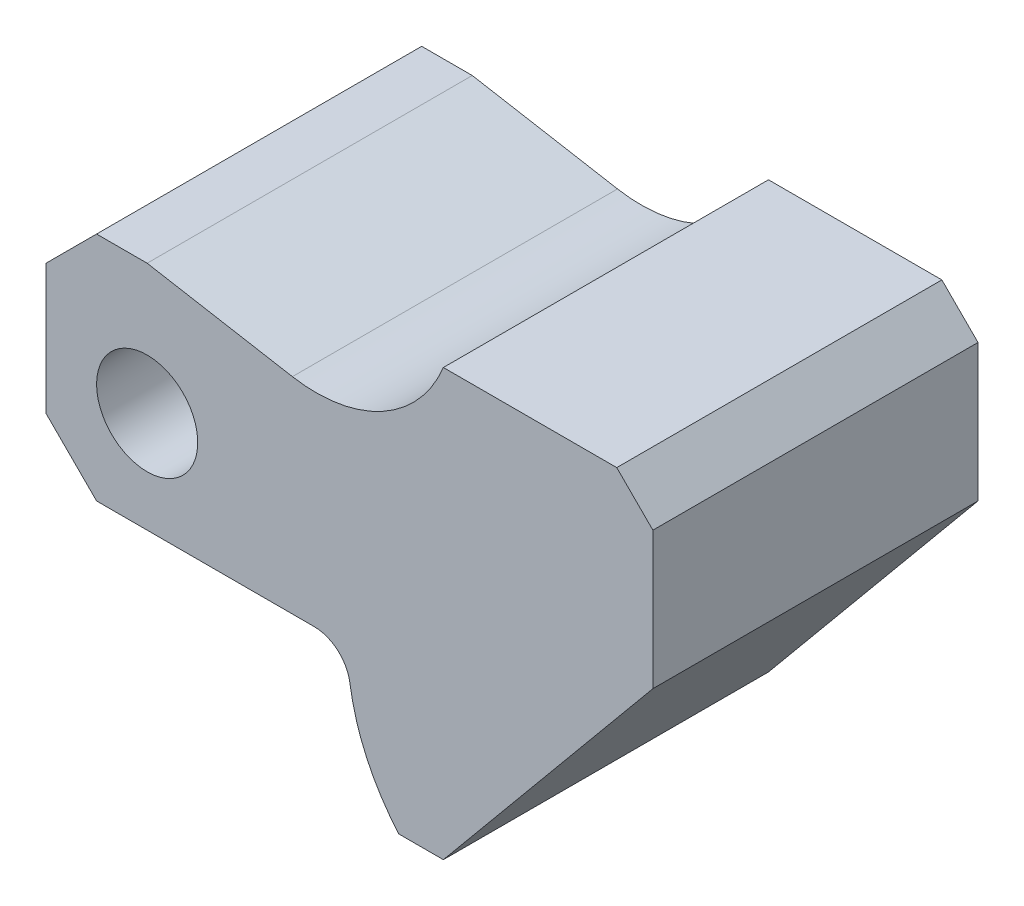
ISO-10303-21;
HEADER;
FILE_DESCRIPTION(('STEP AP214'),'2;1');
FILE_NAME('part.step','',(''),(''),'','','');
FILE_SCHEMA(('AUTOMOTIVE_DESIGN { 1 0 10303 214 1 1 1 1 }'));
ENDSEC;
DATA;
#1=APPLICATION_CONTEXT('core data for automotive mechanical design processes');
#2=APPLICATION_PROTOCOL_DEFINITION('international standard','automotive_design',2000,#1);
#3=PRODUCT_CONTEXT('',#1,'mechanical');
#4=PRODUCT('Part','Part','',(#3));
#5=PRODUCT_RELATED_PRODUCT_CATEGORY('part','',(#4));
#6=PRODUCT_DEFINITION_FORMATION('','',#4);
#7=PRODUCT_DEFINITION_CONTEXT('part definition',#1,'design');
#8=PRODUCT_DEFINITION('design','',#6,#7);
#9=PRODUCT_DEFINITION_SHAPE('','',#8);
#10=(LENGTH_UNIT() NAMED_UNIT(*) SI_UNIT(.MILLI.,.METRE.));
#11=(NAMED_UNIT(*) PLANE_ANGLE_UNIT() SI_UNIT($,.RADIAN.));
#12=(NAMED_UNIT(*) SI_UNIT($,.STERADIAN.) SOLID_ANGLE_UNIT());
#13=UNCERTAINTY_MEASURE_WITH_UNIT(LENGTH_MEASURE(1.E-05),#10,'distance_accuracy_value','');
#14=(GEOMETRIC_REPRESENTATION_CONTEXT(3) GLOBAL_UNCERTAINTY_ASSIGNED_CONTEXT((#13)) GLOBAL_UNIT_ASSIGNED_CONTEXT((#10,
#11,#12)) REPRESENTATION_CONTEXT('',''));
#15=CARTESIAN_POINT('',(0.,0.,0.));
#16=DIRECTION('',(0.,0.,1.));
#17=DIRECTION('',(1.,0.,0.));
#18=AXIS2_PLACEMENT_3D('',#15,#16,#17);
#19=CARTESIAN_POINT('',(30.4033577276848,47.1664622192664,22.5));
#20=DIRECTION('',(0.,0.,-1.));
#21=DIRECTION('',(-1.,0.,0.));
#22=AXIS2_PLACEMENT_3D('',#19,#20,#21);
#23=PLANE('',#22);
#24=DIRECTION('',(1.,0.,0.));
#25=VECTOR('',#24,1.);
#26=CARTESIAN_POINT('',(30.1125137012567,0.,22.5));
#27=LINE('',#26,#25);
#28=CARTESIAN_POINT('',(0.,0.,22.5));
#29=VERTEX_POINT('',#28);
#30=CARTESIAN_POINT('',(30.1125137012567,0.,22.5));
#31=VERTEX_POINT('',#30);
#32=EDGE_CURVE('E197',#29,#31,#27,.T.);
#33=ORIENTED_EDGE('',*,*,#32,.T.);
#34=CARTESIAN_POINT('',(30.1125137012567,-5.,22.5));
#35=DIRECTION('',(0.,0.,-1.));
#36=DIRECTION('',(1.,0.,0.));
#37=AXIS2_PLACEMENT_3D('',#34,#35,#36);
#38=CIRCLE('',#37,5.);
#39=CARTESIAN_POINT('',(35.0581524426685,-4.26470588235294,22.5));
#40=VERTEX_POINT('',#39);
#41=EDGE_CURVE('E115',#31,#40,#38,.T.);
#42=ORIENTED_EDGE('',*,*,#41,.T.);
#43=CARTESIAN_POINT('',(63.7428571428571,0.,22.5));
#44=DIRECTION('',(0.,0.,1.));
#45=DIRECTION('',(-1.,0.,0.));
#46=AXIS2_PLACEMENT_3D('',#43,#44,#45);
#47=CIRCLE('',#46,29.);
#48=CARTESIAN_POINT('',(41.8339548426505,-19.,22.5));
#49=VERTEX_POINT('',#48);
#50=EDGE_CURVE('E230',#40,#49,#47,.T.);
#51=ORIENTED_EDGE('',*,*,#50,.T.);
#52=DIRECTION('',(1.,0.,0.));
#53=VECTOR('',#52,1.);
#54=CARTESIAN_POINT('',(48.,-19.,22.5));
#55=LINE('',#54,#53);
#56=CARTESIAN_POINT('',(48.,-19.,22.5));
#57=VERTEX_POINT('',#56);
#58=EDGE_CURVE('E249',#49,#57,#55,.T.);
#59=ORIENTED_EDGE('',*,*,#58,.T.);
#60=DIRECTION('',(0.638017864750323,0.770021560905562,0.));
#61=VECTOR('',#60,1.);
#62=CARTESIAN_POINT('',(77.,16.,22.5));
#63=LINE('',#62,#61);
#64=CARTESIAN_POINT('',(77.,16.,22.5));
#65=VERTEX_POINT('',#64);
#66=EDGE_CURVE('E246',#57,#65,#63,.T.);
#67=ORIENTED_EDGE('',*,*,#66,.T.);
#68=DIRECTION('',(0.,1.,0.));
#69=VECTOR('',#68,1.);
#70=CARTESIAN_POINT('',(77.,35.,22.5));
#71=LINE('',#70,#69);
#72=CARTESIAN_POINT('',(77.,35.,22.5));
#73=VERTEX_POINT('',#72);
#74=EDGE_CURVE('E248',#65,#73,#71,.T.);
#75=ORIENTED_EDGE('',*,*,#74,.T.);
#76=DIRECTION('',(-0.70710678118654,0.707106781186555,0.));
#77=VECTOR('',#76,1.);
#78=CARTESIAN_POINT('',(77.,35.,22.5));
#79=LINE('',#78,#77);
#80=CARTESIAN_POINT('',(72.0000000000001,40.,22.5));
#81=VERTEX_POINT('',#80);
#82=EDGE_CURVE('E251',#73,#81,#79,.T.);
#83=ORIENTED_EDGE('',*,*,#82,.T.);
#84=DIRECTION('',(-1.,0.,0.));
#85=VECTOR('',#84,1.);
#86=CARTESIAN_POINT('',(72.0000000000001,40.,22.5));
#87=LINE('',#86,#85);
#88=CARTESIAN_POINT('',(48.,40.,22.5));
#89=VERTEX_POINT('',#88);
#90=EDGE_CURVE('E257',#81,#89,#87,.T.);
#91=ORIENTED_EDGE('',*,*,#90,.T.);
#92=CARTESIAN_POINT('',(30.4033577276848,47.1664622192664,22.5));
#93=DIRECTION('',(0.,0.,-1.));
#94=DIRECTION('',(-1.,0.,0.));
#95=AXIS2_PLACEMENT_3D('',#92,#93,#94);
#96=CIRCLE('',#95,19.);
#97=CARTESIAN_POINT('',(27.1040423520132,28.4551149120344,22.5));
#98=VERTEX_POINT('',#97);
#99=EDGE_CURVE('E259',#89,#98,#96,.T.);
#100=ORIENTED_EDGE('',*,*,#99,.T.);
#101=DIRECTION('',(-0.984807753012208,0.173648177666931,0.));
#102=VECTOR('',#101,1.);
#103=CARTESIAN_POINT('',(6.99999999999998,32.,22.5));
#104=LINE('',#103,#102);
#105=CARTESIAN_POINT('',(6.99999999999998,32.,22.5));
#106=VERTEX_POINT('',#105);
#107=EDGE_CURVE('E261',#98,#106,#104,.T.);
#108=ORIENTED_EDGE('',*,*,#107,.T.);
#109=DIRECTION('',(-1.,0.,0.));
#110=VECTOR('',#109,1.);
#111=CARTESIAN_POINT('',(0.,32.,22.5));
#112=LINE('',#111,#110);
#113=CARTESIAN_POINT('',(0.,32.,22.5));
#114=VERTEX_POINT('',#113);
#115=EDGE_CURVE('E152',#106,#114,#112,.T.);
#116=ORIENTED_EDGE('',*,*,#115,.T.);
#117=DIRECTION('',(-0.707106781186549,-0.707106781186546,0.));
#118=VECTOR('',#117,1.);
#119=CARTESIAN_POINT('',(-7.00000000000003,25.,22.5));
#120=LINE('',#119,#118);
#121=CARTESIAN_POINT('',(-7.00000000000003,25.,22.5));
#122=VERTEX_POINT('',#121);
#123=EDGE_CURVE('E146',#114,#122,#120,.T.);
#124=ORIENTED_EDGE('',*,*,#123,.T.);
#125=DIRECTION('',(0.,-1.,0.));
#126=VECTOR('',#125,1.);
#127=CARTESIAN_POINT('',(-7.00000000000002,7.,22.5));
#128=LINE('',#127,#126);
#129=CARTESIAN_POINT('',(-7.00000000000002,7.,22.5));
#130=VERTEX_POINT('',#129);
#131=EDGE_CURVE('E150',#122,#130,#128,.T.);
#132=ORIENTED_EDGE('',*,*,#131,.T.);
#133=DIRECTION('',(0.707106781186549,-0.707106781186546,0.));
#134=VECTOR('',#133,1.);
#135=CARTESIAN_POINT('',(0.,0.,22.5));
#136=LINE('',#135,#134);
#137=EDGE_CURVE('E54',#130,#29,#136,.T.);
#138=ORIENTED_EDGE('',*,*,#137,.T.);
#139=EDGE_LOOP('',(#33,#42,#51,#59,#67,#75,#83,#91,#100,#108,#116,#124,#132,#138));
#140=FACE_BOUND('',#139,.T.);
#141=CARTESIAN_POINT('',(6.99999999999998,14.,22.5));
#142=DIRECTION('',(0.,0.,1.));
#143=DIRECTION('',(1.,0.,0.));
#144=AXIS2_PLACEMENT_3D('',#141,#142,#143);
#145=CIRCLE('',#144,7.);
#146=CARTESIAN_POINT('',(0.,14.,22.5));
#147=VERTEX_POINT('',#146);
#148=EDGE_CURVE('E174',#147,#147,#145,.T.);
#149=ORIENTED_EDGE('',*,*,#148,.F.);
#150=EDGE_LOOP('',(#149));
#151=FACE_BOUND('',#150,.T.);
#152=ADVANCED_FACE('F37',(#140,#151),#23,.F.);
#153=CARTESIAN_POINT('',(30.4033577276848,47.1664622192664,-22.5));
#154=DIRECTION('',(0.,0.,-1.));
#155=DIRECTION('',(-1.,0.,0.));
#156=AXIS2_PLACEMENT_3D('',#153,#154,#155);
#157=PLANE('',#156);
#158=DIRECTION('',(1.,0.,0.));
#159=VECTOR('',#158,1.);
#160=CARTESIAN_POINT('',(30.1125137012567,0.,-22.5));
#161=LINE('',#160,#159);
#162=CARTESIAN_POINT('',(0.,0.,-22.5));
#163=VERTEX_POINT('',#162);
#164=CARTESIAN_POINT('',(30.1125137012567,0.,-22.5));
#165=VERTEX_POINT('',#164);
#166=EDGE_CURVE('E170',#163,#165,#161,.T.);
#167=ORIENTED_EDGE('',*,*,#166,.F.);
#168=DIRECTION('',(0.707106781186549,-0.707106781186546,0.));
#169=VECTOR('',#168,1.);
#170=CARTESIAN_POINT('',(0.,0.,-22.5));
#171=LINE('',#170,#169);
#172=CARTESIAN_POINT('',(-7.00000000000002,7.,-22.5));
#173=VERTEX_POINT('',#172);
#174=EDGE_CURVE('E107',#173,#163,#171,.T.);
#175=ORIENTED_EDGE('',*,*,#174,.F.);
#176=DIRECTION('',(0.,-1.,0.));
#177=VECTOR('',#176,1.);
#178=CARTESIAN_POINT('',(-7.00000000000002,7.,-22.5));
#179=LINE('',#178,#177);
#180=CARTESIAN_POINT('',(-7.00000000000003,25.,-22.5));
#181=VERTEX_POINT('',#180);
#182=EDGE_CURVE('E101',#181,#173,#179,.T.);
#183=ORIENTED_EDGE('',*,*,#182,.F.);
#184=DIRECTION('',(-0.707106781186549,-0.707106781186546,0.));
#185=VECTOR('',#184,1.);
#186=CARTESIAN_POINT('',(-7.00000000000003,25.,-22.5));
#187=LINE('',#186,#185);
#188=CARTESIAN_POINT('',(0.,32.,-22.5));
#189=VERTEX_POINT('',#188);
#190=EDGE_CURVE('E160',#189,#181,#187,.T.);
#191=ORIENTED_EDGE('',*,*,#190,.F.);
#192=DIRECTION('',(-1.,0.,0.));
#193=VECTOR('',#192,1.);
#194=CARTESIAN_POINT('',(0.,32.,-22.5));
#195=LINE('',#194,#193);
#196=CARTESIAN_POINT('',(6.99999999999998,32.,-22.5));
#197=VERTEX_POINT('',#196);
#198=EDGE_CURVE('E192',#197,#189,#195,.T.);
#199=ORIENTED_EDGE('',*,*,#198,.F.);
#200=DIRECTION('',(-0.984807753012208,0.173648177666931,0.));
#201=VECTOR('',#200,1.);
#202=CARTESIAN_POINT('',(6.99999999999998,32.,-22.5));
#203=LINE('',#202,#201);
#204=CARTESIAN_POINT('',(27.1040423520132,28.4551149120344,-22.5));
#205=VERTEX_POINT('',#204);
#206=EDGE_CURVE('E190',#205,#197,#203,.T.);
#207=ORIENTED_EDGE('',*,*,#206,.F.);
#208=CARTESIAN_POINT('',(30.4033577276848,47.1664622192664,-22.5));
#209=DIRECTION('',(0.,0.,-1.));
#210=DIRECTION('',(-1.,0.,0.));
#211=AXIS2_PLACEMENT_3D('',#208,#209,#210);
#212=CIRCLE('',#211,19.);
#213=CARTESIAN_POINT('',(48.,40.,-22.5));
#214=VERTEX_POINT('',#213);
#215=EDGE_CURVE('E188',#214,#205,#212,.T.);
#216=ORIENTED_EDGE('',*,*,#215,.F.);
#217=DIRECTION('',(-1.,0.,0.));
#218=VECTOR('',#217,1.);
#219=CARTESIAN_POINT('',(72.0000000000001,40.,-22.5));
#220=LINE('',#219,#218);
#221=CARTESIAN_POINT('',(72.0000000000001,40.,-22.5));
#222=VERTEX_POINT('',#221);
#223=EDGE_CURVE('E186',#222,#214,#220,.T.);
#224=ORIENTED_EDGE('',*,*,#223,.F.);
#225=DIRECTION('',(-0.70710678118654,0.707106781186555,0.));
#226=VECTOR('',#225,1.);
#227=CARTESIAN_POINT('',(77.,35.,-22.5));
#228=LINE('',#227,#226);
#229=CARTESIAN_POINT('',(77.,35.,-22.5));
#230=VERTEX_POINT('',#229);
#231=EDGE_CURVE('E184',#230,#222,#228,.T.);
#232=ORIENTED_EDGE('',*,*,#231,.F.);
#233=DIRECTION('',(0.,1.,0.));
#234=VECTOR('',#233,1.);
#235=CARTESIAN_POINT('',(77.,35.,-22.5));
#236=LINE('',#235,#234);
#237=CARTESIAN_POINT('',(77.,16.,-22.5));
#238=VERTEX_POINT('',#237);
#239=EDGE_CURVE('E182',#238,#230,#236,.T.);
#240=ORIENTED_EDGE('',*,*,#239,.F.);
#241=DIRECTION('',(0.638017864750323,0.770021560905562,0.));
#242=VECTOR('',#241,1.);
#243=CARTESIAN_POINT('',(77.,16.,-22.5));
#244=LINE('',#243,#242);
#245=CARTESIAN_POINT('',(48.,-19.,-22.5));
#246=VERTEX_POINT('',#245);
#247=EDGE_CURVE('E180',#246,#238,#244,.T.);
#248=ORIENTED_EDGE('',*,*,#247,.F.);
#249=DIRECTION('',(1.,0.,0.));
#250=VECTOR('',#249,1.);
#251=CARTESIAN_POINT('',(48.,-19.,-22.5));
#252=LINE('',#251,#250);
#253=CARTESIAN_POINT('',(41.8339548426505,-19.,-22.5));
#254=VERTEX_POINT('',#253);
#255=EDGE_CURVE('E178',#254,#246,#252,.T.);
#256=ORIENTED_EDGE('',*,*,#255,.F.);
#257=CARTESIAN_POINT('',(63.7428571428571,0.,-22.5));
#258=DIRECTION('',(0.,0.,1.));
#259=DIRECTION('',(-1.,0.,0.));
#260=AXIS2_PLACEMENT_3D('',#257,#258,#259);
#261=CIRCLE('',#260,29.);
#262=CARTESIAN_POINT('',(35.0581524426685,-4.26470588235294,-22.5));
#263=VERTEX_POINT('',#262);
#264=EDGE_CURVE('E176',#263,#254,#261,.T.);
#265=ORIENTED_EDGE('',*,*,#264,.F.);
#266=CARTESIAN_POINT('',(30.1125137012567,-5.,-22.5));
#267=DIRECTION('',(0.,0.,-1.));
#268=DIRECTION('',(1.,0.,0.));
#269=AXIS2_PLACEMENT_3D('',#266,#267,#268);
#270=CIRCLE('',#269,5.);
#271=EDGE_CURVE('E173',#165,#263,#270,.T.);
#272=ORIENTED_EDGE('',*,*,#271,.F.);
#273=EDGE_LOOP('',(#167,#175,#183,#191,#199,#207,#216,#224,#232,#240,#248,#256,#265,#272));
#274=FACE_BOUND('',#273,.T.);
#275=CARTESIAN_POINT('',(6.99999999999998,14.,-22.5));
#276=DIRECTION('',(0.,0.,1.));
#277=DIRECTION('',(1.,0.,0.));
#278=AXIS2_PLACEMENT_3D('',#275,#276,#277);
#279=CIRCLE('',#278,7.);
#280=CARTESIAN_POINT('',(0.,14.,-22.5));
#281=VERTEX_POINT('',#280);
#282=EDGE_CURVE('E434',#281,#281,#279,.T.);
#283=ORIENTED_EDGE('',*,*,#282,.T.);
#284=EDGE_LOOP('',(#283));
#285=FACE_BOUND('',#284,.T.);
#286=ADVANCED_FACE('F234',(#274,#285),#157,.T.);
#287=CARTESIAN_POINT('',(30.1125137012567,0.,22.5));
#288=DIRECTION('',(0.,1.,0.));
#289=DIRECTION('',(0.,0.,1.));
#290=AXIS2_PLACEMENT_3D('',#287,#288,#289);
#291=PLANE('',#290);
#292=ORIENTED_EDGE('',*,*,#166,.T.);
#293=DIRECTION('',(0.,0.,-1.));
#294=VECTOR('',#293,1.);
#295=CARTESIAN_POINT('',(30.1125137012567,0.,22.5));
#296=LINE('',#295,#294);
#297=EDGE_CURVE('E11',#31,#165,#296,.T.);
#298=ORIENTED_EDGE('',*,*,#297,.F.);
#299=ORIENTED_EDGE('',*,*,#32,.F.);
#300=DIRECTION('',(0.,0.,-1.));
#301=VECTOR('',#300,1.);
#302=CARTESIAN_POINT('',(0.,0.,22.5));
#303=LINE('',#302,#301);
#304=EDGE_CURVE('E166',#29,#163,#303,.T.);
#305=ORIENTED_EDGE('',*,*,#304,.T.);
#306=EDGE_LOOP('',(#292,#298,#299,#305));
#307=FACE_BOUND('',#306,.T.);
#308=ADVANCED_FACE('F39',(#307),#291,.F.);
#309=CARTESIAN_POINT('',(30.1125137012567,-5.,22.5));
#310=DIRECTION('',(0.,0.,-1.));
#311=DIRECTION('',(-1.,0.,0.));
#312=AXIS2_PLACEMENT_3D('',#309,#310,#311);
#313=CYLINDRICAL_SURFACE('',#312,5.);
#314=ORIENTED_EDGE('',*,*,#271,.T.);
#315=DIRECTION('',(0.,0.,-1.));
#316=VECTOR('',#315,1.);
#317=CARTESIAN_POINT('',(35.0581524426685,-4.26470588235294,22.5));
#318=LINE('',#317,#316);
#319=EDGE_CURVE('E46',#40,#263,#318,.T.);
#320=ORIENTED_EDGE('',*,*,#319,.F.);
#321=ORIENTED_EDGE('',*,*,#41,.F.);
#322=ORIENTED_EDGE('',*,*,#297,.T.);
#323=EDGE_LOOP('',(#314,#320,#321,#322));
#324=FACE_BOUND('',#323,.T.);
#325=ADVANCED_FACE('F295',(#324),#313,.F.);
#326=CARTESIAN_POINT('',(63.7428571428571,0.,22.5));
#327=DIRECTION('',(0.,0.,-1.));
#328=DIRECTION('',(-1.,0.,0.));
#329=AXIS2_PLACEMENT_3D('',#326,#327,#328);
#330=CYLINDRICAL_SURFACE('',#329,29.);
#331=ORIENTED_EDGE('',*,*,#264,.T.);
#332=DIRECTION('',(0.,0.,-1.));
#333=VECTOR('',#332,1.);
#334=CARTESIAN_POINT('',(41.8339548426505,-19.,22.5));
#335=LINE('',#334,#333);
#336=EDGE_CURVE('E222',#49,#254,#335,.T.);
#337=ORIENTED_EDGE('',*,*,#336,.F.);
#338=ORIENTED_EDGE('',*,*,#50,.F.);
#339=ORIENTED_EDGE('',*,*,#319,.T.);
#340=EDGE_LOOP('',(#331,#337,#338,#339));
#341=FACE_BOUND('',#340,.T.);
#342=ADVANCED_FACE('F228',(#341),#330,.T.);
#343=CARTESIAN_POINT('',(48.,-19.,22.5));
#344=DIRECTION('',(0.,1.,0.));
#345=DIRECTION('',(-1.,0.,0.));
#346=AXIS2_PLACEMENT_3D('',#343,#344,#345);
#347=PLANE('',#346);
#348=ORIENTED_EDGE('',*,*,#255,.T.);
#349=DIRECTION('',(0.,0.,-1.));
#350=VECTOR('',#349,1.);
#351=CARTESIAN_POINT('',(48.,-19.,22.5));
#352=LINE('',#351,#350);
#353=EDGE_CURVE('E219',#57,#246,#352,.T.);
#354=ORIENTED_EDGE('',*,*,#353,.F.);
#355=ORIENTED_EDGE('',*,*,#58,.F.);
#356=ORIENTED_EDGE('',*,*,#336,.T.);
#357=EDGE_LOOP('',(#348,#354,#355,#356));
#358=FACE_BOUND('',#357,.T.);
#359=ADVANCED_FACE('F240',(#358),#347,.F.);
#360=CARTESIAN_POINT('',(77.,16.,22.5));
#361=DIRECTION('',(-0.770021560905562,0.638017864750323,0.));
#362=DIRECTION('',(-0.638017864750323,-0.770021560905562,0.));
#363=AXIS2_PLACEMENT_3D('',#360,#361,#362);
#364=PLANE('',#363);
#365=ORIENTED_EDGE('',*,*,#247,.T.);
#366=DIRECTION('',(0.,0.,-1.));
#367=VECTOR('',#366,1.);
#368=CARTESIAN_POINT('',(77.,16.,22.5));
#369=LINE('',#368,#367);
#370=EDGE_CURVE('E216',#65,#238,#369,.T.);
#371=ORIENTED_EDGE('',*,*,#370,.F.);
#372=ORIENTED_EDGE('',*,*,#66,.F.);
#373=ORIENTED_EDGE('',*,*,#353,.T.);
#374=EDGE_LOOP('',(#365,#371,#372,#373));
#375=FACE_BOUND('',#374,.T.);
#376=ADVANCED_FACE('F244',(#375),#364,.F.);
#377=CARTESIAN_POINT('',(77.,35.,22.5));
#378=DIRECTION('',(-1.,0.,0.));
#379=DIRECTION('',(0.,0.,1.));
#380=AXIS2_PLACEMENT_3D('',#377,#378,#379);
#381=PLANE('',#380);
#382=ORIENTED_EDGE('',*,*,#239,.T.);
#383=DIRECTION('',(0.,0.,-1.));
#384=VECTOR('',#383,1.);
#385=CARTESIAN_POINT('',(77.,35.,22.5));
#386=LINE('',#385,#384);
#387=EDGE_CURVE('E213',#73,#230,#386,.T.);
#388=ORIENTED_EDGE('',*,*,#387,.F.);
#389=ORIENTED_EDGE('',*,*,#74,.F.);
#390=ORIENTED_EDGE('',*,*,#370,.T.);
#391=EDGE_LOOP('',(#382,#388,#389,#390));
#392=FACE_BOUND('',#391,.T.);
#393=ADVANCED_FACE('F308',(#392),#381,.F.);
#394=CARTESIAN_POINT('',(77.,35.,22.5));
#395=DIRECTION('',(-0.707106781186555,-0.70710678118654,0.));
#396=DIRECTION('',(0.70710678118654,-0.707106781186555,0.));
#397=AXIS2_PLACEMENT_3D('',#394,#395,#396);
#398=PLANE('',#397);
#399=ORIENTED_EDGE('',*,*,#231,.T.);
#400=DIRECTION('',(0.,0.,-1.));
#401=VECTOR('',#400,1.);
#402=CARTESIAN_POINT('',(72.0000000000001,40.,22.5));
#403=LINE('',#402,#401);
#404=EDGE_CURVE('E210',#81,#222,#403,.T.);
#405=ORIENTED_EDGE('',*,*,#404,.F.);
#406=ORIENTED_EDGE('',*,*,#82,.F.);
#407=ORIENTED_EDGE('',*,*,#387,.T.);
#408=EDGE_LOOP('',(#399,#405,#406,#407));
#409=FACE_BOUND('',#408,.T.);
#410=ADVANCED_FACE('F311',(#409),#398,.F.);
#411=CARTESIAN_POINT('',(72.0000000000001,40.,22.5));
#412=DIRECTION('',(0.,-1.,0.));
#413=DIRECTION('',(0.,0.,-1.));
#414=AXIS2_PLACEMENT_3D('',#411,#412,#413);
#415=PLANE('',#414);
#416=ORIENTED_EDGE('',*,*,#223,.T.);
#417=DIRECTION('',(0.,0.,-1.));
#418=VECTOR('',#417,1.);
#419=CARTESIAN_POINT('',(48.,40.,22.5));
#420=LINE('',#419,#418);
#421=EDGE_CURVE('E207',#89,#214,#420,.T.);
#422=ORIENTED_EDGE('',*,*,#421,.F.);
#423=ORIENTED_EDGE('',*,*,#90,.F.);
#424=ORIENTED_EDGE('',*,*,#404,.T.);
#425=EDGE_LOOP('',(#416,#422,#423,#424));
#426=FACE_BOUND('',#425,.T.);
#427=ADVANCED_FACE('F315',(#426),#415,.F.);
#428=CARTESIAN_POINT('',(30.4033577276848,47.1664622192664,22.5));
#429=DIRECTION('',(0.,0.,-1.));
#430=DIRECTION('',(-1.,0.,0.));
#431=AXIS2_PLACEMENT_3D('',#428,#429,#430);
#432=CYLINDRICAL_SURFACE('',#431,19.);
#433=ORIENTED_EDGE('',*,*,#215,.T.);
#434=DIRECTION('',(0.,0.,-1.));
#435=VECTOR('',#434,1.);
#436=CARTESIAN_POINT('',(27.1040423520132,28.4551149120344,22.5));
#437=LINE('',#436,#435);
#438=EDGE_CURVE('E204',#98,#205,#437,.T.);
#439=ORIENTED_EDGE('',*,*,#438,.F.);
#440=ORIENTED_EDGE('',*,*,#99,.F.);
#441=ORIENTED_EDGE('',*,*,#421,.T.);
#442=EDGE_LOOP('',(#433,#439,#440,#441));
#443=FACE_BOUND('',#442,.T.);
#444=ADVANCED_FACE('F319',(#443),#432,.F.);
#445=CARTESIAN_POINT('',(6.99999999999998,32.,22.5));
#446=DIRECTION('',(-0.173648177666931,-0.984807753012208,0.));
#447=DIRECTION('',(0.984807753012208,-0.173648177666931,0.));
#448=AXIS2_PLACEMENT_3D('',#445,#446,#447);
#449=PLANE('',#448);
#450=ORIENTED_EDGE('',*,*,#206,.T.);
#451=DIRECTION('',(0.,0.,-1.));
#452=VECTOR('',#451,1.);
#453=CARTESIAN_POINT('',(6.99999999999998,32.,22.5));
#454=LINE('',#453,#452);
#455=EDGE_CURVE('E201',#106,#197,#454,.T.);
#456=ORIENTED_EDGE('',*,*,#455,.F.);
#457=ORIENTED_EDGE('',*,*,#107,.F.);
#458=ORIENTED_EDGE('',*,*,#438,.T.);
#459=EDGE_LOOP('',(#450,#456,#457,#458));
#460=FACE_BOUND('',#459,.T.);
#461=ADVANCED_FACE('F267',(#460),#449,.F.);
#462=CARTESIAN_POINT('',(0.,32.,22.5));
#463=DIRECTION('',(0.,-1.,0.));
#464=DIRECTION('',(0.,0.,-1.));
#465=AXIS2_PLACEMENT_3D('',#462,#463,#464);
#466=PLANE('',#465);
#467=ORIENTED_EDGE('',*,*,#198,.T.);
#468=DIRECTION('',(0.,0.,-1.));
#469=VECTOR('',#468,1.);
#470=CARTESIAN_POINT('',(0.,32.,22.5));
#471=LINE('',#470,#469);
#472=EDGE_CURVE('E161',#114,#189,#471,.T.);
#473=ORIENTED_EDGE('',*,*,#472,.F.);
#474=ORIENTED_EDGE('',*,*,#115,.F.);
#475=ORIENTED_EDGE('',*,*,#455,.T.);
#476=EDGE_LOOP('',(#467,#473,#474,#475));
#477=FACE_BOUND('',#476,.T.);
#478=ADVANCED_FACE('F271',(#477),#466,.F.);
#479=CARTESIAN_POINT('',(-7.00000000000003,25.,22.5));
#480=DIRECTION('',(0.707106781186546,-0.707106781186549,0.));
#481=DIRECTION('',(0.707106781186549,0.707106781186546,0.));
#482=AXIS2_PLACEMENT_3D('',#479,#480,#481);
#483=PLANE('',#482);
#484=ORIENTED_EDGE('',*,*,#190,.T.);
#485=DIRECTION('',(0.,0.,-1.));
#486=VECTOR('',#485,1.);
#487=CARTESIAN_POINT('',(-7.00000000000003,25.,22.5));
#488=LINE('',#487,#486);
#489=EDGE_CURVE('E157',#122,#181,#488,.T.);
#490=ORIENTED_EDGE('',*,*,#489,.F.);
#491=ORIENTED_EDGE('',*,*,#123,.F.);
#492=ORIENTED_EDGE('',*,*,#472,.T.);
#493=EDGE_LOOP('',(#484,#490,#491,#492));
#494=FACE_BOUND('',#493,.T.);
#495=ADVANCED_FACE('F158',(#494),#483,.F.);
#496=CARTESIAN_POINT('',(-7.00000000000002,7.,22.5));
#497=DIRECTION('',(1.,0.,0.));
#498=DIRECTION('',(0.,1.,0.));
#499=AXIS2_PLACEMENT_3D('',#496,#497,#498);
#500=PLANE('',#499);
#501=ORIENTED_EDGE('',*,*,#182,.T.);
#502=DIRECTION('',(0.,0.,-1.));
#503=VECTOR('',#502,1.);
#504=CARTESIAN_POINT('',(-7.00000000000002,7.,22.5));
#505=LINE('',#504,#503);
#506=EDGE_CURVE('E162',#130,#173,#505,.T.);
#507=ORIENTED_EDGE('',*,*,#506,.F.);
#508=ORIENTED_EDGE('',*,*,#131,.F.);
#509=ORIENTED_EDGE('',*,*,#489,.T.);
#510=EDGE_LOOP('',(#501,#507,#508,#509));
#511=FACE_BOUND('',#510,.T.);
#512=ADVANCED_FACE('F164',(#511),#500,.F.);
#513=CARTESIAN_POINT('',(0.,0.,22.5));
#514=DIRECTION('',(0.707106781186546,0.707106781186549,0.));
#515=DIRECTION('',(-0.707106781186549,0.707106781186546,0.));
#516=AXIS2_PLACEMENT_3D('',#513,#514,#515);
#517=PLANE('',#516);
#518=ORIENTED_EDGE('',*,*,#174,.T.);
#519=ORIENTED_EDGE('',*,*,#304,.F.);
#520=ORIENTED_EDGE('',*,*,#137,.F.);
#521=ORIENTED_EDGE('',*,*,#506,.T.);
#522=EDGE_LOOP('',(#518,#519,#520,#521));
#523=FACE_BOUND('',#522,.T.);
#524=ADVANCED_FACE('F275',(#523),#517,.F.);
#525=CARTESIAN_POINT('',(6.99999999999998,14.,22.5));
#526=DIRECTION('',(0.,0.,-1.));
#527=DIRECTION('',(-1.,0.,0.));
#528=AXIS2_PLACEMENT_3D('',#525,#526,#527);
#529=CYLINDRICAL_SURFACE('',#528,7.);
#530=CARTESIAN_POINT('',(0.,14.,22.5));
#531=CARTESIAN_POINT('',(0.,14.,22.03125));
#532=CARTESIAN_POINT('',(0.,14.,21.5625));
#533=CARTESIAN_POINT('',(0.,14.,20.625));
#534=CARTESIAN_POINT('',(0.,14.,20.15625));
#535=CARTESIAN_POINT('',(0.,14.,19.21875));
#536=CARTESIAN_POINT('',(0.,14.,18.75));
#537=CARTESIAN_POINT('',(0.,14.,17.8125));
#538=CARTESIAN_POINT('',(0.,14.,17.34375));
#539=CARTESIAN_POINT('',(0.,14.,16.40625));
#540=CARTESIAN_POINT('',(0.,14.,15.9375));
#541=CARTESIAN_POINT('',(0.,14.,15.));
#542=CARTESIAN_POINT('',(0.,14.,14.53125));
#543=CARTESIAN_POINT('',(0.,14.,13.59375));
#544=CARTESIAN_POINT('',(0.,14.,13.125));
#545=CARTESIAN_POINT('',(0.,14.,12.1875));
#546=CARTESIAN_POINT('',(0.,14.,11.71875));
#547=CARTESIAN_POINT('',(0.,14.,10.78125));
#548=CARTESIAN_POINT('',(0.,14.,10.3125));
#549=CARTESIAN_POINT('',(0.,14.,9.37499999999999));
#550=CARTESIAN_POINT('',(0.,14.,8.90625));
#551=CARTESIAN_POINT('',(0.,14.,7.96874999999999));
#552=CARTESIAN_POINT('',(0.,14.,7.5));
#553=CARTESIAN_POINT('',(0.,14.,6.5625));
#554=CARTESIAN_POINT('',(0.,14.,6.09375));
#555=CARTESIAN_POINT('',(0.,14.,5.15625));
#556=CARTESIAN_POINT('',(0.,14.,4.6875));
#557=CARTESIAN_POINT('',(0.,14.,3.75));
#558=CARTESIAN_POINT('',(0.,14.,3.28125));
#559=CARTESIAN_POINT('',(0.,14.,2.34375));
#560=CARTESIAN_POINT('',(0.,14.,1.875));
#561=CARTESIAN_POINT('',(0.,14.,0.937499999999997));
#562=CARTESIAN_POINT('',(0.,14.,0.468749999999997));
#563=CARTESIAN_POINT('',(0.,14.,-0.468750000000004));
#564=CARTESIAN_POINT('',(0.,14.,-0.937500000000004));
#565=CARTESIAN_POINT('',(0.,14.,-1.87500000000001));
#566=CARTESIAN_POINT('',(0.,14.,-2.34375000000001));
#567=CARTESIAN_POINT('',(0.,14.,-3.28125));
#568=CARTESIAN_POINT('',(0.,14.,-3.75));
#569=CARTESIAN_POINT('',(0.,14.,-4.6875));
#570=CARTESIAN_POINT('',(0.,14.,-5.15625));
#571=CARTESIAN_POINT('',(0.,14.,-6.09375000000001));
#572=CARTESIAN_POINT('',(0.,14.,-6.56250000000001));
#573=CARTESIAN_POINT('',(0.,14.,-7.50000000000001));
#574=CARTESIAN_POINT('',(0.,14.,-7.96875000000001));
#575=CARTESIAN_POINT('',(0.,14.,-8.90625));
#576=CARTESIAN_POINT('',(0.,14.,-9.37500000000001));
#577=CARTESIAN_POINT('',(0.,14.,-10.3125));
#578=CARTESIAN_POINT('',(0.,14.,-10.78125));
#579=CARTESIAN_POINT('',(0.,14.,-11.71875));
#580=CARTESIAN_POINT('',(0.,14.,-12.1875));
#581=CARTESIAN_POINT('',(0.,14.,-13.125));
#582=CARTESIAN_POINT('',(0.,14.,-13.59375));
#583=CARTESIAN_POINT('',(0.,14.,-14.53125));
#584=CARTESIAN_POINT('',(0.,14.,-15.));
#585=CARTESIAN_POINT('',(0.,14.,-15.9375));
#586=CARTESIAN_POINT('',(0.,14.,-16.40625));
#587=CARTESIAN_POINT('',(0.,14.,-17.34375));
#588=CARTESIAN_POINT('',(0.,14.,-17.8125));
#589=CARTESIAN_POINT('',(0.,14.,-18.75));
#590=CARTESIAN_POINT('',(0.,14.,-19.21875));
#591=CARTESIAN_POINT('',(0.,14.,-20.15625));
#592=CARTESIAN_POINT('',(0.,14.,-20.625));
#593=CARTESIAN_POINT('',(0.,14.,-21.5625));
#594=CARTESIAN_POINT('',(0.,14.,-22.03125));
#595=CARTESIAN_POINT('',(0.,14.,-22.5));
#596=B_SPLINE_CURVE_WITH_KNOTS('',3,(#530,#531,#532,#533,#534,#535,#536,#537,#538,#539,#540,
#541,#542,#543,#544,#545,#546,#547,#548,#549,#550,#551,#552,#553,#554,#555,#556,#557,#558,#559,
#560,#561,#562,#563,#564,#565,#566,#567,#568,#569,#570,#571,#572,#573,#574,#575,#576,#577,#578,
#579,#580,#581,#582,#583,#584,#585,#586,#587,#588,#589,#590,#591,#592,#593,#594,#595),
.UNSPECIFIED.,.F.,.F.,(4,2,2,2,2,2,2,2,2,2,2,2,2,2,2,2,2,2,2,2,2,2,2,2,2,2,2,2,2,2,2,2,4),(0.,
1.40625,2.8125,4.21875,5.625,7.03125,8.4375,9.84375,11.25,12.65625,14.0625,15.46875,16.875,
18.28125,19.6875,21.09375,22.5,23.90625,25.3125,26.71875,28.125,29.53125,30.9375,32.34375,33.75,
35.15625,36.5625,37.96875,39.375,40.78125,42.1875,43.59375,45.),.UNSPECIFIED.);
#597=EDGE_CURVE('BSEAM277',#147,#281,#596,.T.);
#598=ORIENTED_EDGE('',*,*,#148,.T.);
#599=ORIENTED_EDGE('',*,*,#282,.F.);
#600=ORIENTED_EDGE('',*,*,#597,.T.);
#601=ORIENTED_EDGE('',*,*,#597,.F.);
#602=EDGE_LOOP('',(#598,#600,#599,#601));
#603=FACE_BOUND('',#602,.T.);
#604=ADVANCED_FACE('F277',(#603),#529,.F.);
#605=CLOSED_SHELL('',(#152,#286,#308,#325,#342,#359,#376,#393,#410,#427,#444,#461,#478,#495,
#512,#524,#604));
#606=MANIFOLD_SOLID_BREP('B2',#605);
#607=ADVANCED_BREP_SHAPE_REPRESENTATION('',(#18,#606),#14);
#608=SHAPE_DEFINITION_REPRESENTATION(#9,#607);
ENDSEC;
END-ISO-10303-21;
